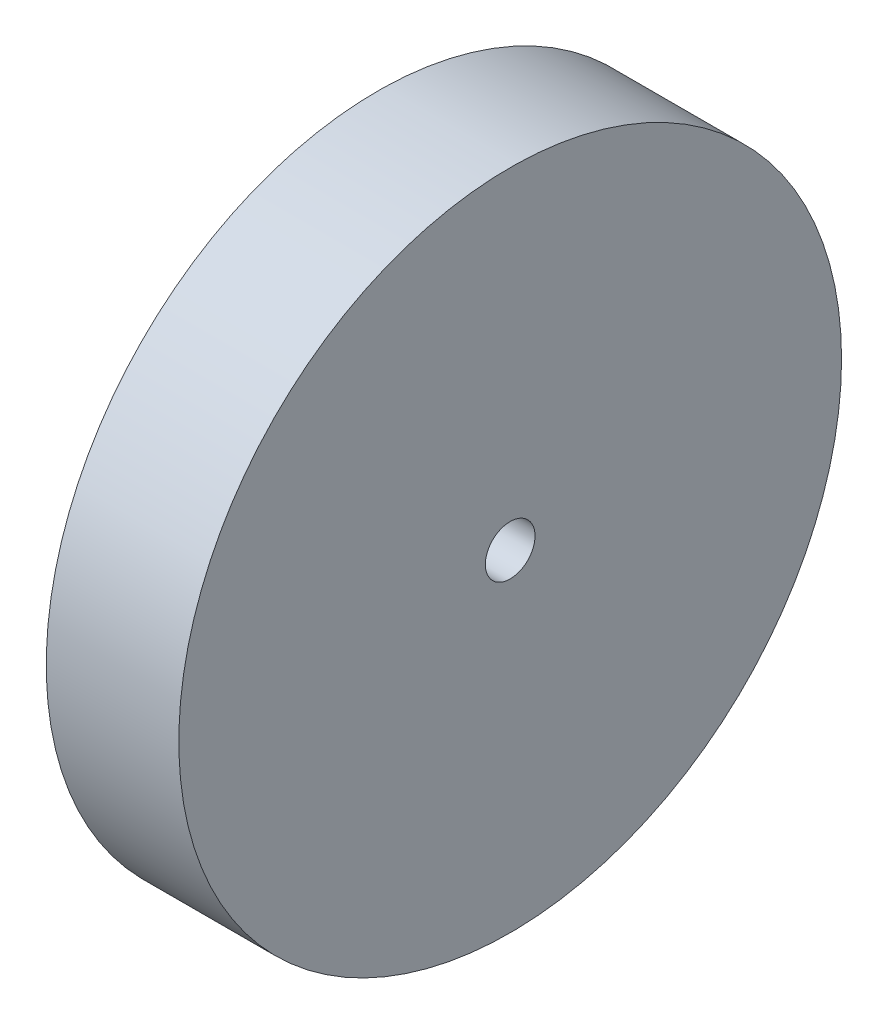
ISO-10303-21;
HEADER;
FILE_DESCRIPTION(('STEP AP214'),'2;1');
FILE_NAME('part.step','',(''),(''),'','','');
FILE_SCHEMA(('AUTOMOTIVE_DESIGN { 1 0 10303 214 1 1 1 1 }'));
ENDSEC;
DATA;
#1=APPLICATION_CONTEXT('core data for automotive mechanical design processes');
#2=APPLICATION_PROTOCOL_DEFINITION('international standard','automotive_design',2000,#1);
#3=PRODUCT_CONTEXT('',#1,'mechanical');
#4=PRODUCT('Part','Part','',(#3));
#5=PRODUCT_RELATED_PRODUCT_CATEGORY('part','',(#4));
#6=PRODUCT_DEFINITION_FORMATION('','',#4);
#7=PRODUCT_DEFINITION_CONTEXT('part definition',#1,'design');
#8=PRODUCT_DEFINITION('design','',#6,#7);
#9=PRODUCT_DEFINITION_SHAPE('','',#8);
#10=(LENGTH_UNIT() NAMED_UNIT(*) SI_UNIT(.MILLI.,.METRE.));
#11=(NAMED_UNIT(*) PLANE_ANGLE_UNIT() SI_UNIT($,.RADIAN.));
#12=(NAMED_UNIT(*) SI_UNIT($,.STERADIAN.) SOLID_ANGLE_UNIT());
#13=UNCERTAINTY_MEASURE_WITH_UNIT(LENGTH_MEASURE(1.E-05),#10,'distance_accuracy_value','');
#14=(GEOMETRIC_REPRESENTATION_CONTEXT(3) GLOBAL_UNCERTAINTY_ASSIGNED_CONTEXT((#13)) GLOBAL_UNIT_ASSIGNED_CONTEXT((#10,
#11,#12)) REPRESENTATION_CONTEXT('',''));
#15=CARTESIAN_POINT('',(0.,0.,0.));
#16=DIRECTION('',(0.,0.,1.));
#17=DIRECTION('',(1.,0.,0.));
#18=AXIS2_PLACEMENT_3D('',#15,#16,#17);
#19=CARTESIAN_POINT('',(50.8,0.,0.));
#20=DIRECTION('',(-1.,0.,0.));
#21=DIRECTION('',(0.,0.,1.));
#22=AXIS2_PLACEMENT_3D('',#19,#20,#21);
#23=CYLINDRICAL_SURFACE('',#22,127.);
#24=CARTESIAN_POINT('',(50.8,0.,0.));
#25=DIRECTION('',(1.,0.,0.));
#26=DIRECTION('',(0.,0.,-1.));
#27=AXIS2_PLACEMENT_3D('',#24,#25,#26);
#28=CIRCLE('',#27,127.);
#29=CARTESIAN_POINT('',(50.8,0.,-127.));
#30=VERTEX_POINT('',#29);
#31=EDGE_CURVE('E10',#30,#30,#28,.T.);
#32=ORIENTED_EDGE('',*,*,#31,.F.);
#33=EDGE_LOOP('',(#32));
#34=FACE_BOUND('',#33,.T.);
#35=CARTESIAN_POINT('',(0.,0.,0.));
#36=DIRECTION('',(1.,0.,0.));
#37=DIRECTION('',(0.,0.,-1.));
#38=AXIS2_PLACEMENT_3D('',#35,#36,#37);
#39=CIRCLE('',#38,127.);
#40=CARTESIAN_POINT('',(0.,0.,-127.));
#41=VERTEX_POINT('',#40);
#42=EDGE_CURVE('E34',#41,#41,#39,.T.);
#43=ORIENTED_EDGE('',*,*,#42,.T.);
#44=EDGE_LOOP('',(#43));
#45=FACE_BOUND('',#44,.T.);
#46=ADVANCED_FACE('F31',(#34,#45),#23,.T.);
#47=CARTESIAN_POINT('',(50.8,0.,0.));
#48=DIRECTION('',(1.,0.,0.));
#49=DIRECTION('',(0.,0.,-1.));
#50=AXIS2_PLACEMENT_3D('',#47,#48,#49);
#51=PLANE('',#50);
#52=CARTESIAN_POINT('',(50.8,0.,0.));
#53=DIRECTION('',(1.,0.,0.));
#54=DIRECTION('',(0.,0.,-1.));
#55=AXIS2_PLACEMENT_3D('',#52,#53,#54);
#56=CIRCLE('',#55,9.525);
#57=CARTESIAN_POINT('',(50.8,0.,-9.525));
#58=VERTEX_POINT('',#57);
#59=EDGE_CURVE('E43',#58,#58,#56,.T.);
#60=ORIENTED_EDGE('',*,*,#59,.F.);
#61=EDGE_LOOP('',(#60));
#62=FACE_BOUND('',#61,.T.);
#63=ORIENTED_EDGE('',*,*,#31,.T.);
#64=EDGE_LOOP('',(#63));
#65=FACE_BOUND('',#64,.T.);
#66=ADVANCED_FACE('F58',(#62,#65),#51,.T.);
#67=CARTESIAN_POINT('',(0.,0.,0.));
#68=DIRECTION('',(1.,0.,0.));
#69=DIRECTION('',(0.,0.,-1.));
#70=AXIS2_PLACEMENT_3D('',#67,#68,#69);
#71=PLANE('',#70);
#72=CARTESIAN_POINT('',(0.,0.,0.));
#73=DIRECTION('',(1.,0.,0.));
#74=DIRECTION('',(0.,0.,-1.));
#75=AXIS2_PLACEMENT_3D('',#72,#73,#74);
#76=CIRCLE('',#75,9.525);
#77=CARTESIAN_POINT('',(0.,0.,-9.525));
#78=VERTEX_POINT('',#77);
#79=EDGE_CURVE('E41',#78,#78,#76,.T.);
#80=ORIENTED_EDGE('',*,*,#79,.T.);
#81=EDGE_LOOP('',(#80));
#82=FACE_BOUND('',#81,.T.);
#83=ORIENTED_EDGE('',*,*,#42,.F.);
#84=EDGE_LOOP('',(#83));
#85=FACE_BOUND('',#84,.T.);
#86=ADVANCED_FACE('F49',(#82,#85),#71,.F.);
#87=CARTESIAN_POINT('',(0.,0.,0.));
#88=DIRECTION('',(1.,0.,0.));
#89=DIRECTION('',(0.,0.,-1.));
#90=AXIS2_PLACEMENT_3D('',#87,#88,#89);
#91=CYLINDRICAL_SURFACE('',#90,9.525);
#92=ORIENTED_EDGE('',*,*,#79,.F.);
#93=EDGE_LOOP('',(#92));
#94=FACE_BOUND('',#93,.T.);
#95=ORIENTED_EDGE('',*,*,#59,.T.);
#96=EDGE_LOOP('',(#95));
#97=FACE_BOUND('',#96,.T.);
#98=ADVANCED_FACE('F52',(#94,#97),#91,.F.);
#99=CLOSED_SHELL('',(#46,#66,#86,#98));
#100=MANIFOLD_SOLID_BREP('B2',#99);
#101=ADVANCED_BREP_SHAPE_REPRESENTATION('',(#18,#100),#14);
#102=SHAPE_DEFINITION_REPRESENTATION(#9,#101);
ENDSEC;
END-ISO-10303-21;
